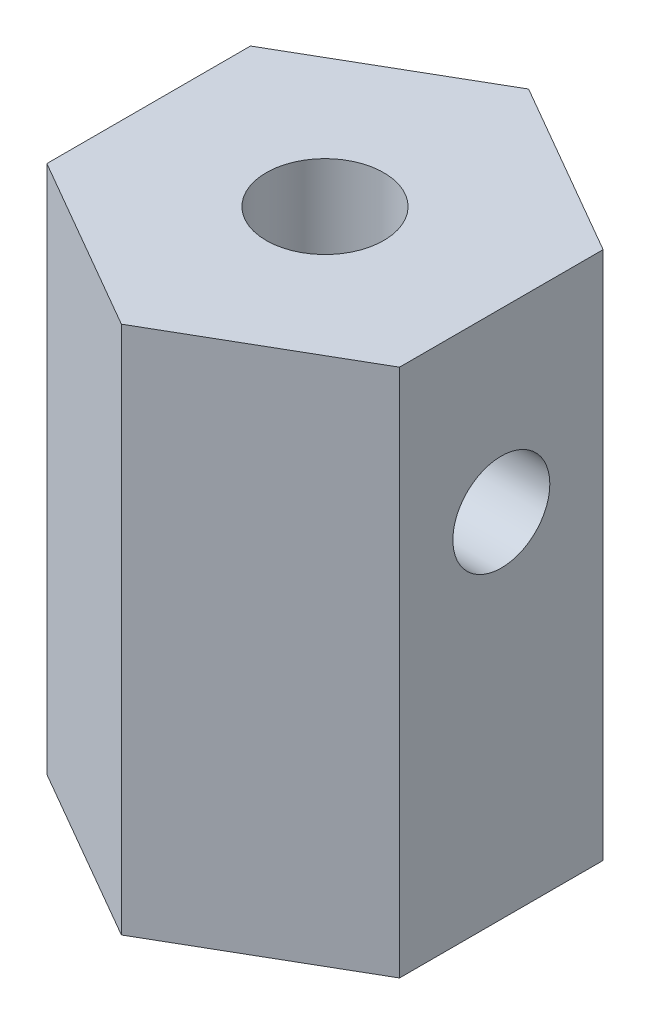
ISO-10303-21;
HEADER;
FILE_DESCRIPTION(('STEP AP214'),'2;1');
FILE_NAME('part.step','',(''),(''),'','','');
FILE_SCHEMA(('AUTOMOTIVE_DESIGN { 1 0 10303 214 1 1 1 1 }'));
ENDSEC;
DATA;
#1=APPLICATION_CONTEXT('core data for automotive mechanical design processes');
#2=APPLICATION_PROTOCOL_DEFINITION('international standard','automotive_design',2000,#1);
#3=PRODUCT_CONTEXT('',#1,'mechanical');
#4=PRODUCT('Part','Part','',(#3));
#5=PRODUCT_RELATED_PRODUCT_CATEGORY('part','',(#4));
#6=PRODUCT_DEFINITION_FORMATION('','',#4);
#7=PRODUCT_DEFINITION_CONTEXT('part definition',#1,'design');
#8=PRODUCT_DEFINITION('design','',#6,#7);
#9=PRODUCT_DEFINITION_SHAPE('','',#8);
#10=(LENGTH_UNIT() NAMED_UNIT(*) SI_UNIT(.MILLI.,.METRE.));
#11=(NAMED_UNIT(*) PLANE_ANGLE_UNIT() SI_UNIT($,.RADIAN.));
#12=(NAMED_UNIT(*) SI_UNIT($,.STERADIAN.) SOLID_ANGLE_UNIT());
#13=UNCERTAINTY_MEASURE_WITH_UNIT(LENGTH_MEASURE(1.E-05),#10,'distance_accuracy_value','');
#14=(GEOMETRIC_REPRESENTATION_CONTEXT(3) GLOBAL_UNCERTAINTY_ASSIGNED_CONTEXT((#13)) GLOBAL_UNIT_ASSIGNED_CONTEXT((#10,
#11,#12)) REPRESENTATION_CONTEXT('',''));
#15=CARTESIAN_POINT('',(0.,0.,0.));
#16=DIRECTION('',(0.,0.,1.));
#17=DIRECTION('',(1.,0.,0.));
#18=AXIS2_PLACEMENT_3D('',#15,#16,#17);
#19=CARTESIAN_POINT('',(0.,18.,6.92820323027551));
#20=DIRECTION('',(-0.5,0.,-0.866025403784439));
#21=DIRECTION('',(-0.866025403784439,0.,0.5));
#22=AXIS2_PLACEMENT_3D('',#19,#20,#21);
#23=PLANE('',#22);
#24=DIRECTION('',(0.866025403784439,0.,-0.5));
#25=VECTOR('',#24,1.);
#26=CARTESIAN_POINT('',(0.,0.,6.92820323027551));
#27=LINE('',#26,#25);
#28=CARTESIAN_POINT('',(0.,0.,6.92820323027551));
#29=VERTEX_POINT('',#28);
#30=CARTESIAN_POINT('',(6.,0.,3.46410161513775));
#31=VERTEX_POINT('',#30);
#32=EDGE_CURVE('E135',#29,#31,#27,.T.);
#33=ORIENTED_EDGE('',*,*,#32,.T.);
#34=DIRECTION('',(0.,-1.,0.));
#35=VECTOR('',#34,1.);
#36=CARTESIAN_POINT('',(6.,18.,3.46410161513775));
#37=LINE('',#36,#35);
#38=CARTESIAN_POINT('',(6.,18.,3.46410161513775));
#39=VERTEX_POINT('',#38);
#40=EDGE_CURVE('E13',#39,#31,#37,.T.);
#41=ORIENTED_EDGE('',*,*,#40,.F.);
#42=DIRECTION('',(0.866025403784439,0.,-0.5));
#43=VECTOR('',#42,1.);
#44=CARTESIAN_POINT('',(0.,18.,6.92820323027551));
#45=LINE('',#44,#43);
#46=CARTESIAN_POINT('',(0.,18.,6.92820323027551));
#47=VERTEX_POINT('',#46);
#48=EDGE_CURVE('E146',#47,#39,#45,.T.);
#49=ORIENTED_EDGE('',*,*,#48,.F.);
#50=DIRECTION('',(0.,-1.,0.));
#51=VECTOR('',#50,1.);
#52=CARTESIAN_POINT('',(0.,18.,6.92820323027551));
#53=LINE('',#52,#51);
#54=EDGE_CURVE('E131',#47,#29,#53,.T.);
#55=ORIENTED_EDGE('',*,*,#54,.T.);
#56=EDGE_LOOP('',(#33,#41,#49,#55));
#57=FACE_BOUND('',#56,.T.);
#58=ADVANCED_FACE('F45',(#57),#23,.F.);
#59=CARTESIAN_POINT('',(6.,18.,3.46410161513775));
#60=DIRECTION('',(-1.,0.,0.));
#61=DIRECTION('',(0.,0.,1.));
#62=AXIS2_PLACEMENT_3D('',#59,#60,#61);
#63=PLANE('',#62);
#64=CARTESIAN_POINT('',(6.,12.,0.));
#65=DIRECTION('',(1.,0.,0.));
#66=DIRECTION('',(0.,0.,-1.));
#67=AXIS2_PLACEMENT_3D('',#64,#65,#66);
#68=CIRCLE('',#67,1.64999999999999);
#69=CARTESIAN_POINT('',(6.,12.,-1.64999999999999));
#70=VERTEX_POINT('',#69);
#71=EDGE_CURVE('E262',#70,#70,#68,.T.);
#72=ORIENTED_EDGE('',*,*,#71,.F.);
#73=EDGE_LOOP('',(#72));
#74=FACE_BOUND('',#73,.T.);
#75=DIRECTION('',(0.,0.,-1.));
#76=VECTOR('',#75,1.);
#77=CARTESIAN_POINT('',(6.,0.,3.46410161513775));
#78=LINE('',#77,#76);
#79=CARTESIAN_POINT('',(6.,0.,-3.46410161513776));
#80=VERTEX_POINT('',#79);
#81=EDGE_CURVE('E138',#31,#80,#78,.T.);
#82=ORIENTED_EDGE('',*,*,#81,.T.);
#83=DIRECTION('',(0.,-1.,0.));
#84=VECTOR('',#83,1.);
#85=CARTESIAN_POINT('',(6.,18.,-3.46410161513776));
#86=LINE('',#85,#84);
#87=CARTESIAN_POINT('',(6.,18.,-3.46410161513776));
#88=VERTEX_POINT('',#87);
#89=EDGE_CURVE('E59',#88,#80,#86,.T.);
#90=ORIENTED_EDGE('',*,*,#89,.F.);
#91=DIRECTION('',(0.,0.,-1.));
#92=VECTOR('',#91,1.);
#93=CARTESIAN_POINT('',(6.,18.,3.46410161513775));
#94=LINE('',#93,#92);
#95=EDGE_CURVE('E104',#39,#88,#94,.T.);
#96=ORIENTED_EDGE('',*,*,#95,.F.);
#97=ORIENTED_EDGE('',*,*,#40,.T.);
#98=EDGE_LOOP('',(#82,#90,#96,#97));
#99=FACE_BOUND('',#98,.T.);
#100=ADVANCED_FACE('F172',(#74,#99),#63,.F.);
#101=CARTESIAN_POINT('',(6.,18.,-3.46410161513776));
#102=DIRECTION('',(-0.5,0.,0.866025403784439));
#103=DIRECTION('',(0.866025403784439,0.,0.5));
#104=AXIS2_PLACEMENT_3D('',#101,#102,#103);
#105=PLANE('',#104);
#106=DIRECTION('',(-0.866025403784439,0.,-0.5));
#107=VECTOR('',#106,1.);
#108=CARTESIAN_POINT('',(6.,0.,-3.46410161513776));
#109=LINE('',#108,#107);
#110=CARTESIAN_POINT('',(0.,0.,-6.92820323027551));
#111=VERTEX_POINT('',#110);
#112=EDGE_CURVE('E141',#80,#111,#109,.T.);
#113=ORIENTED_EDGE('',*,*,#112,.T.);
#114=DIRECTION('',(0.,-1.,0.));
#115=VECTOR('',#114,1.);
#116=CARTESIAN_POINT('',(0.,18.,-6.92820323027551));
#117=LINE('',#116,#115);
#118=CARTESIAN_POINT('',(0.,18.,-6.92820323027551));
#119=VERTEX_POINT('',#118);
#120=EDGE_CURVE('E126',#119,#111,#117,.T.);
#121=ORIENTED_EDGE('',*,*,#120,.F.);
#122=DIRECTION('',(-0.866025403784439,0.,-0.5));
#123=VECTOR('',#122,1.);
#124=CARTESIAN_POINT('',(6.,18.,-3.46410161513776));
#125=LINE('',#124,#123);
#126=EDGE_CURVE('E117',#88,#119,#125,.T.);
#127=ORIENTED_EDGE('',*,*,#126,.F.);
#128=ORIENTED_EDGE('',*,*,#89,.T.);
#129=EDGE_LOOP('',(#113,#121,#127,#128));
#130=FACE_BOUND('',#129,.T.);
#131=ADVANCED_FACE('F153',(#130),#105,.F.);
#132=CARTESIAN_POINT('',(0.,18.,-6.92820323027551));
#133=DIRECTION('',(0.5,0.,0.866025403784439));
#134=DIRECTION('',(0.866025403784439,0.,-0.5));
#135=AXIS2_PLACEMENT_3D('',#132,#133,#134);
#136=PLANE('',#135);
#137=DIRECTION('',(-0.866025403784439,0.,0.5));
#138=VECTOR('',#137,1.);
#139=CARTESIAN_POINT('',(0.,0.,-6.92820323027551));
#140=LINE('',#139,#138);
#141=CARTESIAN_POINT('',(-6.,0.,-3.46410161513776));
#142=VERTEX_POINT('',#141);
#143=EDGE_CURVE('E125',#111,#142,#140,.T.);
#144=ORIENTED_EDGE('',*,*,#143,.T.);
#145=DIRECTION('',(0.,-1.,0.));
#146=VECTOR('',#145,1.);
#147=CARTESIAN_POINT('',(-6.,18.,-3.46410161513776));
#148=LINE('',#147,#146);
#149=CARTESIAN_POINT('',(-6.,18.,-3.46410161513776));
#150=VERTEX_POINT('',#149);
#151=EDGE_CURVE('E122',#150,#142,#148,.T.);
#152=ORIENTED_EDGE('',*,*,#151,.F.);
#153=DIRECTION('',(-0.866025403784439,0.,0.5));
#154=VECTOR('',#153,1.);
#155=CARTESIAN_POINT('',(0.,18.,-6.92820323027551));
#156=LINE('',#155,#154);
#157=EDGE_CURVE('E111',#119,#150,#156,.T.);
#158=ORIENTED_EDGE('',*,*,#157,.F.);
#159=ORIENTED_EDGE('',*,*,#120,.T.);
#160=EDGE_LOOP('',(#144,#152,#158,#159));
#161=FACE_BOUND('',#160,.T.);
#162=ADVANCED_FACE('F123',(#161),#136,.F.);
#163=CARTESIAN_POINT('',(-6.,18.,-3.46410161513776));
#164=DIRECTION('',(1.,0.,0.));
#165=DIRECTION('',(0.,0.,-1.));
#166=AXIS2_PLACEMENT_3D('',#163,#164,#165);
#167=PLANE('',#166);
#168=DIRECTION('',(0.,0.,1.));
#169=VECTOR('',#168,1.);
#170=CARTESIAN_POINT('',(-6.,0.,-3.46410161513776));
#171=LINE('',#170,#169);
#172=CARTESIAN_POINT('',(-6.,0.,3.46410161513775));
#173=VERTEX_POINT('',#172);
#174=EDGE_CURVE('E90',#142,#173,#171,.T.);
#175=ORIENTED_EDGE('',*,*,#174,.T.);
#176=DIRECTION('',(0.,-1.,0.));
#177=VECTOR('',#176,1.);
#178=CARTESIAN_POINT('',(-6.,18.,3.46410161513775));
#179=LINE('',#178,#177);
#180=CARTESIAN_POINT('',(-6.,18.,3.46410161513775));
#181=VERTEX_POINT('',#180);
#182=EDGE_CURVE('E127',#181,#173,#179,.T.);
#183=ORIENTED_EDGE('',*,*,#182,.F.);
#184=DIRECTION('',(0.,0.,1.));
#185=VECTOR('',#184,1.);
#186=CARTESIAN_POINT('',(-6.,18.,-3.46410161513776));
#187=LINE('',#186,#185);
#188=EDGE_CURVE('E115',#150,#181,#187,.T.);
#189=ORIENTED_EDGE('',*,*,#188,.F.);
#190=ORIENTED_EDGE('',*,*,#151,.T.);
#191=EDGE_LOOP('',(#175,#183,#189,#190));
#192=FACE_BOUND('',#191,.T.);
#193=ADVANCED_FACE('F129',(#192),#167,.F.);
#194=CARTESIAN_POINT('',(-6.,18.,3.46410161513775));
#195=DIRECTION('',(0.5,0.,-0.866025403784439));
#196=DIRECTION('',(-0.866025403784439,0.,-0.5));
#197=AXIS2_PLACEMENT_3D('',#194,#195,#196);
#198=PLANE('',#197);
#199=DIRECTION('',(0.866025403784439,0.,0.5));
#200=VECTOR('',#199,1.);
#201=CARTESIAN_POINT('',(-6.,0.,3.46410161513775));
#202=LINE('',#201,#200);
#203=EDGE_CURVE('E96',#173,#29,#202,.T.);
#204=ORIENTED_EDGE('',*,*,#203,.T.);
#205=ORIENTED_EDGE('',*,*,#54,.F.);
#206=DIRECTION('',(0.866025403784439,0.,0.5));
#207=VECTOR('',#206,1.);
#208=CARTESIAN_POINT('',(-6.,18.,3.46410161513775));
#209=LINE('',#208,#207);
#210=EDGE_CURVE('E67',#181,#47,#209,.T.);
#211=ORIENTED_EDGE('',*,*,#210,.F.);
#212=ORIENTED_EDGE('',*,*,#182,.T.);
#213=EDGE_LOOP('',(#204,#205,#211,#212));
#214=FACE_BOUND('',#213,.T.);
#215=ADVANCED_FACE('F160',(#214),#198,.F.);
#216=CARTESIAN_POINT('',(0.,18.,0.));
#217=DIRECTION('',(0.,1.,0.));
#218=DIRECTION('',(0.,0.,1.));
#219=AXIS2_PLACEMENT_3D('',#216,#217,#218);
#220=PLANE('',#219);
#221=CARTESIAN_POINT('',(0.,18.,0.));
#222=DIRECTION('',(0.,1.,0.));
#223=DIRECTION('',(0.,0.,1.));
#224=AXIS2_PLACEMENT_3D('',#221,#222,#223);
#225=CIRCLE('',#224,2.);
#226=CARTESIAN_POINT('',(0.,18.,2.));
#227=VERTEX_POINT('',#226);
#228=EDGE_CURVE('E273',#227,#227,#225,.T.);
#229=ORIENTED_EDGE('',*,*,#228,.F.);
#230=EDGE_LOOP('',(#229));
#231=FACE_BOUND('',#230,.T.);
#232=ORIENTED_EDGE('',*,*,#48,.T.);
#233=ORIENTED_EDGE('',*,*,#95,.T.);
#234=ORIENTED_EDGE('',*,*,#126,.T.);
#235=ORIENTED_EDGE('',*,*,#157,.T.);
#236=ORIENTED_EDGE('',*,*,#188,.T.);
#237=ORIENTED_EDGE('',*,*,#210,.T.);
#238=EDGE_LOOP('',(#232,#233,#234,#235,#236,#237));
#239=FACE_BOUND('',#238,.T.);
#240=ADVANCED_FACE('F113',(#231,#239),#220,.T.);
#241=CARTESIAN_POINT('',(0.,0.,0.));
#242=DIRECTION('',(0.,1.,0.));
#243=DIRECTION('',(0.,0.,1.));
#244=AXIS2_PLACEMENT_3D('',#241,#242,#243);
#245=PLANE('',#244);
#246=CARTESIAN_POINT('',(0.,0.,0.));
#247=DIRECTION('',(0.,-1.,0.));
#248=DIRECTION('',(0.,0.,-1.));
#249=AXIS2_PLACEMENT_3D('',#246,#247,#248);
#250=CIRCLE('',#249,1.65);
#251=CARTESIAN_POINT('',(0.,0.,-1.65));
#252=VERTEX_POINT('',#251);
#253=EDGE_CURVE('E265',#252,#252,#250,.T.);
#254=ORIENTED_EDGE('',*,*,#253,.F.);
#255=EDGE_LOOP('',(#254));
#256=FACE_BOUND('',#255,.T.);
#257=ORIENTED_EDGE('',*,*,#32,.F.);
#258=ORIENTED_EDGE('',*,*,#203,.F.);
#259=ORIENTED_EDGE('',*,*,#174,.F.);
#260=ORIENTED_EDGE('',*,*,#143,.F.);
#261=ORIENTED_EDGE('',*,*,#112,.F.);
#262=ORIENTED_EDGE('',*,*,#81,.F.);
#263=EDGE_LOOP('',(#257,#258,#259,#260,#261,#262));
#264=FACE_BOUND('',#263,.T.);
#265=ADVANCED_FACE('F156',(#256,#264),#245,.F.);
#266=CARTESIAN_POINT('',(0.,8.,0.));
#267=DIRECTION('',(0.,1.,0.));
#268=DIRECTION('',(0.,0.,1.));
#269=AXIS2_PLACEMENT_3D('',#266,#267,#268);
#270=CYLINDRICAL_SURFACE('',#269,2.);
#271=CARTESIAN_POINT('',(1.13026545554574,12.,-1.64999999999999));
#272=CARTESIAN_POINT('',(1.13028415076944,12.059260515376,-1.64999227227882));
#273=CARTESIAN_POINT('',(1.13502591142919,12.118585815563,-1.64676945248433));
#274=CARTESIAN_POINT('',(1.15304173822757,12.2353263830522,-1.63419783551531));
#275=CARTESIAN_POINT('',(1.16634388013209,12.2927347090995,-1.62482887868408));
#276=CARTESIAN_POINT('',(1.20547690344033,12.4255627477462,-1.59612095717538));
#277=CARTESIAN_POINT('',(1.23414234516334,12.4995945923382,-1.57435275047642));
#278=CARTESIAN_POINT('',(1.29806621774549,12.6414927503757,-1.52208388617206));
#279=CARTESIAN_POINT('',(1.33334547250338,12.7093385554545,-1.49155548099387));
#280=CARTESIAN_POINT('',(1.42222300183615,12.8666328532579,-1.4079764465979));
#281=CARTESIAN_POINT('',(1.47726773224048,12.9531107605924,-1.35085848431608));
#282=CARTESIAN_POINT('',(1.5861371945003,13.1143635095207,-1.22121270441163));
#283=CARTESIAN_POINT('',(1.63996300247571,13.1891490479503,-1.14869911651515));
#284=CARTESIAN_POINT('',(1.73075576686599,13.3112198281318,-1.00505161338098));
#285=CARTESIAN_POINT('',(1.76889826123069,13.3609880474015,-0.9367803165797));
#286=CARTESIAN_POINT('',(1.83869568986702,13.4505478516896,-0.791011905073757));
#287=CARTESIAN_POINT('',(1.87036099924608,13.4903554148195,-0.71352986394943));
#288=CARTESIAN_POINT('',(1.92003863633826,13.5521998284645,-0.56439136553573));
#289=CARTESIAN_POINT('',(1.93945690667581,13.5761073542685,-0.493984239207884));
#290=CARTESIAN_POINT('',(1.97070722627487,13.6144072664903,-0.348996465230112));
#291=CARTESIAN_POINT('',(1.98254357394106,13.6288050443955,-0.274418208435063));
#292=CARTESIAN_POINT('',(1.99768401570965,13.647200399507,-0.122807668158561));
#293=CARTESIAN_POINT('',(2.00095397094506,13.6511563643738,-0.045766800508839));
#294=CARTESIAN_POINT('',(1.99856235369188,13.6482573458201,0.107969445625207));
#295=CARTESIAN_POINT('',(1.99290098652025,13.6414026109204,0.184664832010951));
#296=CARTESIAN_POINT('',(1.97379671000668,13.6181511893271,0.330438594090806));
#297=CARTESIAN_POINT('',(1.96087391985351,13.6023919312591,0.399690594450739));
#298=CARTESIAN_POINT('',(1.92857757949744,13.5627041124055,0.534208242042529));
#299=CARTESIAN_POINT('',(1.9092023171223,13.5387733832663,0.599472825762329));
#300=CARTESIAN_POINT('',(1.86320785456575,13.4813393372151,0.73054846440497));
#301=CARTESIAN_POINT('',(1.83609858158257,13.4471752476041,0.795894584928097));
#302=CARTESIAN_POINT('',(1.7771939455929,13.3716689990219,0.919948391449346));
#303=CARTESIAN_POINT('',(1.74539658935478,13.3303237855156,0.978653234921046));
#304=CARTESIAN_POINT('',(1.67171963108471,13.2322381591138,1.10064828175205));
#305=CARTESIAN_POINT('',(1.62911719465582,13.1740835009741,1.16236134200595));
#306=CARTESIAN_POINT('',(1.54195911034385,13.0498150939074,1.27572706450587));
#307=CARTESIAN_POINT('',(1.49740051200199,12.9836890398735,1.32736384220259));
#308=CARTESIAN_POINT('',(1.41010644459443,12.844861410084,1.41970811861179));
#309=CARTESIAN_POINT('',(1.36735399521382,12.7722677170263,1.46056171573082));
#310=CARTESIAN_POINT('',(1.28717415122903,12.619321179569,1.53167497630219));
#311=CARTESIAN_POINT('',(1.24973512700426,12.5389859476871,1.56195799486271));
#312=CARTESIAN_POINT('',(1.1984152588373,12.4013888211003,1.60138777813433));
#313=CARTESIAN_POINT('',(1.18093929490523,12.3465524002447,1.6142104205928));
#314=CARTESIAN_POINT('',(1.15299719020701,12.2341881486954,1.63428776772427));
#315=CARTESIAN_POINT('',(1.14251315468429,12.1766675949391,1.64155669328038));
#316=CARTESIAN_POINT('',(1.13033953247814,12.0596780006102,1.64996891598047));
#317=CARTESIAN_POINT('',(1.12872872011397,12.0001962084218,1.65105734680687));
#318=CARTESIAN_POINT('',(1.13487333460963,11.8819297454341,1.64683678849177));
#319=CARTESIAN_POINT('',(1.14263832831456,11.8231458485974,1.64152126492285));
#320=CARTESIAN_POINT('',(1.16815617652571,11.6973879747465,1.62347982180047));
#321=CARTESIAN_POINT('',(1.18749782996447,11.6309237421604,1.6095596982077));
#322=CARTESIAN_POINT('',(1.23344854168307,11.5024843747581,1.57462287407045));
#323=CARTESIAN_POINT('',(1.26008094126549,11.4405244809227,1.55358332875379));
#324=CARTESIAN_POINT('',(1.33341951279276,11.2878090275839,1.49176915051823));
#325=CARTESIAN_POINT('',(1.38303507818271,11.2002750618747,1.44653306326051));
#326=CARTESIAN_POINT('',(1.48453519345396,11.0353669541869,1.34220157598673));
#327=CARTESIAN_POINT('',(1.53642313229968,10.9580087270396,1.28308485952938));
#328=CARTESIAN_POINT('',(1.63920566799776,10.8116056819958,1.1490724393151));
#329=CARTESIAN_POINT('',(1.690017623352,10.7428990787284,1.07373873685186));
#330=CARTESIAN_POINT('',(1.78412887954789,10.6189777219568,0.908761283766784));
#331=CARTESIAN_POINT('',(1.82745006163973,10.5637234730967,0.819160733032877));
#332=CARTESIAN_POINT('',(1.89053568747178,10.4844126388774,0.656498289867188));
#333=CARTESIAN_POINT('',(1.9134505711351,10.4559846879762,0.586784717597215));
#334=CARTESIAN_POINT('',(1.95191365735138,10.40856628267,0.442272815540212));
#335=CARTESIAN_POINT('',(1.9674674713755,10.3895686388365,0.367478408864374));
#336=CARTESIAN_POINT('',(1.990004906352,10.3621106219168,0.214253921939985));
#337=CARTESIAN_POINT('',(1.99694128043541,10.3537083363002,0.135806223902405));
#338=CARTESIAN_POINT('',(2.00143235704986,10.3482632004161,-0.0217524751306425));
#339=CARTESIAN_POINT('',(1.99898891582435,10.3512181025879,-0.100863341794811));
#340=CARTESIAN_POINT('',(1.98556597861725,10.3675202242764,-0.250369191143566));
#341=CARTESIAN_POINT('',(1.97532813229727,10.3799646570795,-0.320934275077175));
#342=CARTESIAN_POINT('',(1.94798026639519,10.4134251715441,-0.458585583525764));
#343=CARTESIAN_POINT('',(1.93086923617685,10.4344425137774,-0.525671294793427));
#344=CARTESIAN_POINT('',(1.88971965899813,10.48547626439,-0.658860742236347));
#345=CARTESIAN_POINT('',(1.86533788499696,10.5159425790412,-0.724683629772342));
#346=CARTESIAN_POINT('',(1.81156976407853,10.5841177910945,-0.850229115075157));
#347=CARTESIAN_POINT('',(1.78218001185953,10.6218316188715,-0.909947517441124));
#348=CARTESIAN_POINT('',(1.70530487628979,10.7224741147245,-1.04922193468147));
#349=CARTESIAN_POINT('',(1.65576344975117,10.7889691397881,-1.12507582112121));
#350=CARTESIAN_POINT('',(1.55334758816822,10.9332262600945,-1.26272785048503));
#351=CARTESIAN_POINT('',(1.50046569403278,11.0110141128938,-1.32449300754987));
#352=CARTESIAN_POINT('',(1.40540519120628,11.1630051635957,-1.42433941767243));
#353=CARTESIAN_POINT('',(1.36293689648538,11.2355647055671,-1.4646625023852));
#354=CARTESIAN_POINT('',(1.28348372555566,11.3883749388584,-1.5347471096466));
#355=CARTESIAN_POINT('',(1.24648383149606,11.4686035303686,-1.56453788297913));
#356=CARTESIAN_POINT('',(1.19546064576474,11.6073432429132,-1.60359748989876));
#357=CARTESIAN_POINT('',(1.17793529129531,11.663543993462,-1.61639866033694));
#358=CARTESIAN_POINT('',(1.15039619318334,11.778667676055,-1.63611919687714));
#359=CARTESIAN_POINT('',(1.14035358351032,11.8375792064689,-1.64306117976041));
#360=CARTESIAN_POINT('',(1.13183426890593,11.9312434577953,-1.64892627372214));
#361=CARTESIAN_POINT('',(1.13025460661206,11.9656108206252,-1.65000448443601));
#362=CARTESIAN_POINT('',(1.13026545554574,12.,-1.64999999999999));
#363=B_SPLINE_CURVE_WITH_KNOTS('',3,(#271,#272,#273,#274,#275,#276,#277,#278,#279,#280,#281,
#282,#283,#284,#285,#286,#287,#288,#289,#290,#291,#292,#293,#294,#295,#296,#297,#298,#299,#300,
#301,#302,#303,#304,#305,#306,#307,#308,#309,#310,#311,#312,#313,#314,#315,#316,#317,#318,#319,
#320,#321,#322,#323,#324,#325,#326,#327,#328,#329,#330,#331,#332,#333,#334,#335,#336,#337,#338,
#339,#340,#341,#342,#343,#344,#345,#346,#347,#348,#349,#350,#351,#352,#353,#354,#355,#356,#357,
#358,#359,#360,#361,#362),.UNSPECIFIED.,.T.,.F.,(4,2,2,2,2,2,2,2,2,2,2,2,2,2,2,2,2,2,2,2,2,2,2,
2,2,2,2,2,2,2,2,2,2,2,2,2,2,2,2,2,2,2,2,2,2,4),(0.,0.177648530807624,0.355882691473128,
0.601443292499047,0.847790448623784,1.19812833957858,1.54814382224754,1.82520592846371,
2.10182070205135,2.33140490846503,2.5608588416851,2.79122581550893,3.02158749363794,
3.23723550442051,3.45294078334936,3.68777765164434,3.92271465497307,4.20641290294694,
4.49055483092937,4.77062243715898,5.05006727339434,5.22638917376019,5.40225805582105,
5.57968577284945,5.75729468591298,5.96793121535142,6.17925014674008,6.50847192127704,
6.83820262620212,7.17830943304656,7.51740532680623,7.75256707833378,7.98754927206167,
8.22381419784688,8.46003236976816,8.67621339934491,8.89242622792674,9.12113536240785,
9.35000063862291,9.68537800220092,10.0215327023828,10.3004679621606,10.5786223504854,
10.7587522694697,10.9381836552401,11.0412740038956),.UNSPECIFIED.);
#364=CARTESIAN_POINT('',(1.13026545554574,12.,-1.64999999999999));
#365=VERTEX_POINT('',#364);
#366=EDGE_CURVE('E48',#365,#365,#363,.T.);
#367=ORIENTED_EDGE('',*,*,#366,.T.);
#368=EDGE_LOOP('',(#367));
#369=FACE_BOUND('',#368,.T.);
#370=CARTESIAN_POINT('',(0.,8.,0.));
#371=DIRECTION('',(0.,1.,0.));
#372=DIRECTION('',(0.,0.,1.));
#373=AXIS2_PLACEMENT_3D('',#370,#371,#372);
#374=CIRCLE('',#373,2.);
#375=CARTESIAN_POINT('',(0.,8.,2.));
#376=VERTEX_POINT('',#375);
#377=EDGE_CURVE('E139',#376,#376,#374,.T.);
#378=ORIENTED_EDGE('',*,*,#377,.F.);
#379=EDGE_LOOP('',(#378));
#380=FACE_BOUND('',#379,.T.);
#381=ORIENTED_EDGE('',*,*,#228,.T.);
#382=EDGE_LOOP('',(#381));
#383=FACE_BOUND('',#382,.T.);
#384=ADVANCED_FACE('F211',(#369,#380,#383),#270,.F.);
#385=CARTESIAN_POINT('',(0.,8.,0.));
#386=DIRECTION('',(0.,1.,0.));
#387=DIRECTION('',(0.,0.,1.));
#388=AXIS2_PLACEMENT_3D('',#385,#386,#387);
#389=PLANE('',#388);
#390=CARTESIAN_POINT('',(0.,8.,0.));
#391=DIRECTION('',(0.,1.,0.));
#392=DIRECTION('',(0.,0.,1.));
#393=AXIS2_PLACEMENT_3D('',#390,#391,#392);
#394=CIRCLE('',#393,1.65);
#395=CARTESIAN_POINT('',(0.,8.,1.65));
#396=VERTEX_POINT('',#395);
#397=EDGE_CURVE('E267',#396,#396,#394,.T.);
#398=ORIENTED_EDGE('',*,*,#397,.F.);
#399=EDGE_LOOP('',(#398));
#400=FACE_BOUND('',#399,.T.);
#401=ORIENTED_EDGE('',*,*,#377,.T.);
#402=EDGE_LOOP('',(#401));
#403=FACE_BOUND('',#402,.T.);
#404=ADVANCED_FACE('F218',(#400,#403),#389,.T.);
#405=CARTESIAN_POINT('',(0.,0.,0.));
#406=DIRECTION('',(0.,-1.,0.));
#407=DIRECTION('',(0.,0.,-1.));
#408=AXIS2_PLACEMENT_3D('',#405,#406,#407);
#409=CYLINDRICAL_SURFACE('',#408,1.65);
#410=ORIENTED_EDGE('',*,*,#253,.T.);
#411=EDGE_LOOP('',(#410));
#412=FACE_BOUND('',#411,.T.);
#413=ORIENTED_EDGE('',*,*,#397,.T.);
#414=EDGE_LOOP('',(#413));
#415=FACE_BOUND('',#414,.T.);
#416=ADVANCED_FACE('F223',(#412,#415),#409,.F.);
#417=CARTESIAN_POINT('',(6.,12.,0.));
#418=DIRECTION('',(1.,0.,0.));
#419=DIRECTION('',(0.,0.,-1.));
#420=AXIS2_PLACEMENT_3D('',#417,#418,#419);
#421=CYLINDRICAL_SURFACE('',#420,1.64999999999999);
#422=ORIENTED_EDGE('',*,*,#71,.T.);
#423=EDGE_LOOP('',(#422));
#424=FACE_BOUND('',#423,.T.);
#425=ORIENTED_EDGE('',*,*,#366,.F.);
#426=EDGE_LOOP('',(#425));
#427=FACE_BOUND('',#426,.T.);
#428=ADVANCED_FACE('F232',(#424,#427),#421,.F.);
#429=CLOSED_SHELL('',(#58,#100,#131,#162,#193,#215,#240,#265,#384,#404,#416,#428));
#430=MANIFOLD_SOLID_BREP('B2',#429);
#431=ADVANCED_BREP_SHAPE_REPRESENTATION('',(#18,#430),#14);
#432=SHAPE_DEFINITION_REPRESENTATION(#9,#431);
ENDSEC;
END-ISO-10303-21;
